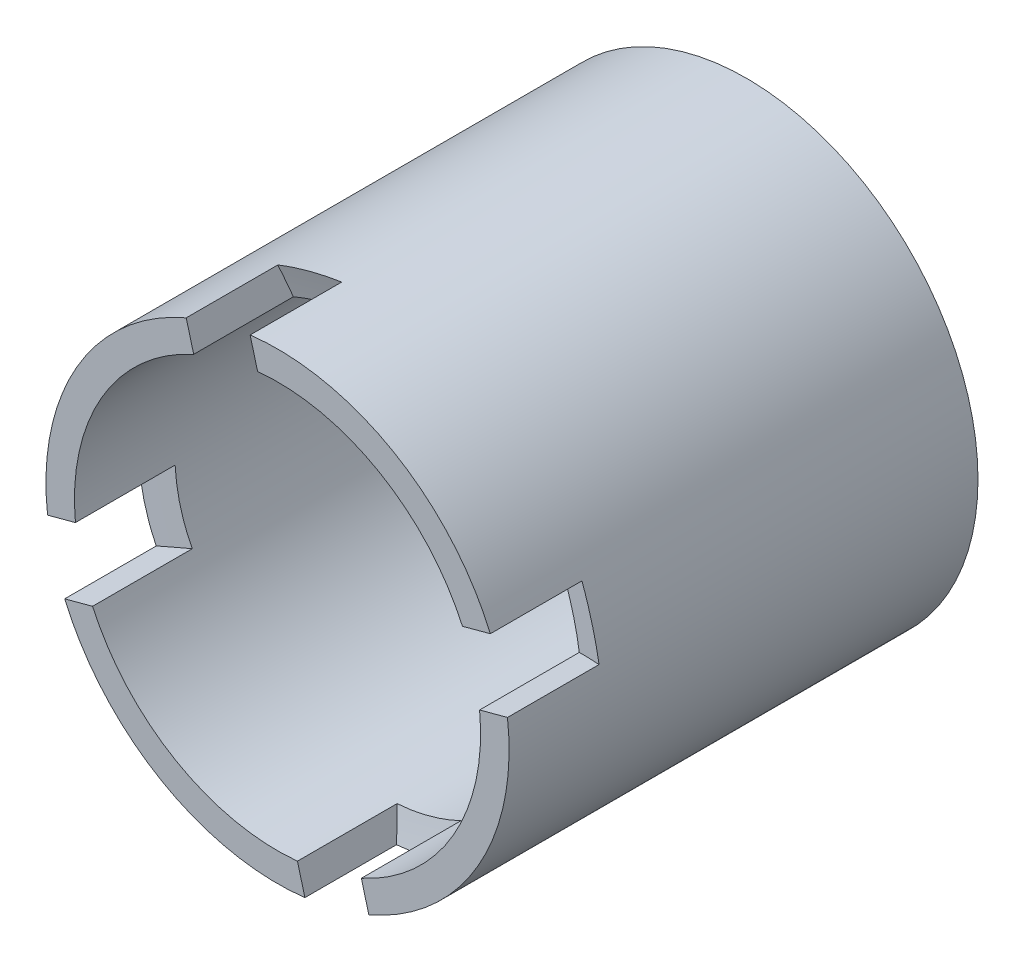
ISO-10303-21;
HEADER;
FILE_DESCRIPTION(('STEP AP214'),'2;1');
FILE_NAME('part.step','',(''),(''),'','','');
FILE_SCHEMA(('AUTOMOTIVE_DESIGN { 1 0 10303 214 1 1 1 1 }'));
ENDSEC;
DATA;
#1=APPLICATION_CONTEXT('core data for automotive mechanical design processes');
#2=APPLICATION_PROTOCOL_DEFINITION('international standard','automotive_design',2000,#1);
#3=PRODUCT_CONTEXT('',#1,'mechanical');
#4=PRODUCT('Part','Part','',(#3));
#5=PRODUCT_RELATED_PRODUCT_CATEGORY('part','',(#4));
#6=PRODUCT_DEFINITION_FORMATION('','',#4);
#7=PRODUCT_DEFINITION_CONTEXT('part definition',#1,'design');
#8=PRODUCT_DEFINITION('design','',#6,#7);
#9=PRODUCT_DEFINITION_SHAPE('','',#8);
#10=(LENGTH_UNIT() NAMED_UNIT(*) SI_UNIT(.MILLI.,.METRE.));
#11=(NAMED_UNIT(*) PLANE_ANGLE_UNIT() SI_UNIT($,.RADIAN.));
#12=(NAMED_UNIT(*) SI_UNIT($,.STERADIAN.) SOLID_ANGLE_UNIT());
#13=UNCERTAINTY_MEASURE_WITH_UNIT(LENGTH_MEASURE(1.E-05),#10,'distance_accuracy_value','');
#14=(GEOMETRIC_REPRESENTATION_CONTEXT(3) GLOBAL_UNCERTAINTY_ASSIGNED_CONTEXT((#13)) GLOBAL_UNIT_ASSIGNED_CONTEXT((#10,
#11,#12)) REPRESENTATION_CONTEXT('',''));
#15=CARTESIAN_POINT('',(0.,0.,0.));
#16=DIRECTION('',(0.,0.,1.));
#17=DIRECTION('',(1.,0.,0.));
#18=AXIS2_PLACEMENT_3D('',#15,#16,#17);
#19=CARTESIAN_POINT('',(0.,0.,90.));
#20=DIRECTION('',(0.,0.,1.));
#21=DIRECTION('',(1.,0.,0.));
#22=AXIS2_PLACEMENT_3D('',#19,#20,#21);
#23=PLANE('',#22);
#24=CARTESIAN_POINT('',(0.,0.,90.));
#25=DIRECTION('',(0.,0.,1.));
#26=DIRECTION('',(1.,0.,0.));
#27=AXIS2_PLACEMENT_3D('',#24,#25,#26);
#28=CIRCLE('',#27,44.45);
#29=CARTESIAN_POINT('',(-40.8502605222262,-17.5230909164521,90.));
#30=VERTEX_POINT('',#29);
#31=CARTESIAN_POINT('',(5.25607059710619,-44.1381492801662,90.));
#32=VERTEX_POINT('',#31);
#33=EDGE_CURVE('E298',#30,#32,#28,.T.);
#34=ORIENTED_EDGE('',*,*,#33,.T.);
#35=DIRECTION('',(-0.258888878578149,0.965907111760002,0.));
#36=VECTOR('',#35,1.);
#37=CARTESIAN_POINT('',(-6.13351015967567,-1.64394437897115,90.));
#38=LINE('',#37,#36);
#39=CARTESIAN_POINT('',(3.82220451233839,-38.7884353171904,90.));
#40=VERTEX_POINT('',#39);
#41=EDGE_CURVE('E315',#32,#40,#38,.T.);
#42=ORIENTED_EDGE('',*,*,#41,.T.);
#43=CARTESIAN_POINT('',(0.,0.,90.));
#44=DIRECTION('',(0.,0.,1.));
#45=DIRECTION('',(1.,0.,0.));
#46=AXIS2_PLACEMENT_3D('',#43,#44,#45);
#47=CIRCLE('',#46,38.9763);
#48=CARTESIAN_POINT('',(-35.5005465592505,-16.0892248316844,90.));
#49=VERTEX_POINT('',#48);
#50=EDGE_CURVE('E292',#49,#40,#47,.T.);
#51=ORIENTED_EDGE('',*,*,#50,.F.);
#52=DIRECTION('',(0.965907111760002,0.258888878578149,0.));
#53=VECTOR('',#52,1.);
#54=CARTESIAN_POINT('',(1.64394437896965,-6.13351015967005,90.));
#55=LINE('',#54,#53);
#56=EDGE_CURVE('E313',#30,#49,#55,.T.);
#57=ORIENTED_EDGE('',*,*,#56,.F.);
#58=EDGE_LOOP('',(#34,#42,#51,#57));
#59=FACE_BOUND('',#58,.T.);
#60=ADVANCED_FACE('F36',(#59),#23,.T.);
#61=CARTESIAN_POINT('',(-17.5230909164573,40.850260522224,90.));
#62=VERTEX_POINT('',#61);
#63=CARTESIAN_POINT('',(-44.138149280167,-5.25607059709964,90.));
#64=VERTEX_POINT('',#63);
#65=EDGE_CURVE('E358',#62,#64,#28,.T.);
#66=ORIENTED_EDGE('',*,*,#65,.T.);
#67=DIRECTION('',(0.965907111760002,0.258888878578149,0.));
#68=VECTOR('',#67,1.);
#69=CARTESIAN_POINT('',(-1.64394437897284,6.13351015968197,90.));
#70=LINE('',#69,#68);
#71=CARTESIAN_POINT('',(-38.788435317191,-3.82220451233181,90.));
#72=VERTEX_POINT('',#71);
#73=EDGE_CURVE('E214',#64,#72,#70,.T.);
#74=ORIENTED_EDGE('',*,*,#73,.T.);
#75=CARTESIAN_POINT('',(-16.0892248316895,35.5005465592481,90.));
#76=VERTEX_POINT('',#75);
#77=EDGE_CURVE('E303',#76,#72,#47,.T.);
#78=ORIENTED_EDGE('',*,*,#77,.F.);
#79=DIRECTION('',(-0.258888878578149,0.965907111760002,0.));
#80=VECTOR('',#79,1.);
#81=CARTESIAN_POINT('',(-6.13351015967546,-1.6439443789711,90.));
#82=LINE('',#81,#80);
#83=EDGE_CURVE('E155',#76,#62,#82,.T.);
#84=ORIENTED_EDGE('',*,*,#83,.T.);
#85=EDGE_LOOP('',(#66,#74,#78,#84));
#86=FACE_BOUND('',#85,.T.);
#87=ADVANCED_FACE('F363',(#86),#23,.T.);
#88=CARTESIAN_POINT('',(35.5005465592453,16.0892248316958,90.));
#89=VERTEX_POINT('',#88);
#90=CARTESIAN_POINT('',(-3.82220451233746,38.7884353171904,90.));
#91=VERTEX_POINT('',#90);
#92=EDGE_CURVE('E293',#89,#91,#47,.T.);
#93=ORIENTED_EDGE('',*,*,#92,.F.);
#94=CARTESIAN_POINT('',(40.8502605222213,17.5230909164636,90.));
#95=VERTEX_POINT('',#94);
#96=EDGE_CURVE('E208',#89,#95,#70,.T.);
#97=ORIENTED_EDGE('',*,*,#96,.T.);
#98=CARTESIAN_POINT('',(-5.25607059710526,44.1381492801663,90.));
#99=VERTEX_POINT('',#98);
#100=EDGE_CURVE('E161',#95,#99,#28,.T.);
#101=ORIENTED_EDGE('',*,*,#100,.T.);
#102=DIRECTION('',(-0.258888878578149,0.965907111760002,0.));
#103=VECTOR('',#102,1.);
#104=CARTESIAN_POINT('',(6.13351015967656,1.64394437897139,90.));
#105=LINE('',#104,#103);
#106=EDGE_CURVE('E349',#91,#99,#105,.T.);
#107=ORIENTED_EDGE('',*,*,#106,.F.);
#108=EDGE_LOOP('',(#93,#97,#101,#107));
#109=FACE_BOUND('',#108,.T.);
#110=ADVANCED_FACE('F357',(#109),#23,.T.);
#111=DIRECTION('',(-0.258888878578149,0.965907111760002,0.));
#112=VECTOR('',#111,1.);
#113=CARTESIAN_POINT('',(6.13351015967636,1.64394437897134,90.));
#114=LINE('',#113,#112);
#115=CARTESIAN_POINT('',(17.5230909164582,-40.8502605222236,90.));
#116=VERTEX_POINT('',#115);
#117=CARTESIAN_POINT('',(16.0892248316904,-35.5005465592477,90.));
#118=VERTEX_POINT('',#117);
#119=EDGE_CURVE('E320',#116,#118,#114,.T.);
#120=ORIENTED_EDGE('',*,*,#119,.F.);
#121=CARTESIAN_POINT('',(44.1381492801655,5.25607059711202,90.));
#122=VERTEX_POINT('',#121);
#123=EDGE_CURVE('E296',#116,#122,#28,.T.);
#124=ORIENTED_EDGE('',*,*,#123,.T.);
#125=CARTESIAN_POINT('',(38.7884353171898,3.82220451234426,90.));
#126=VERTEX_POINT('',#125);
#127=EDGE_CURVE('E339',#126,#122,#55,.T.);
#128=ORIENTED_EDGE('',*,*,#127,.F.);
#129=EDGE_CURVE('E289',#118,#126,#47,.T.);
#130=ORIENTED_EDGE('',*,*,#129,.F.);
#131=EDGE_LOOP('',(#120,#124,#128,#130));
#132=FACE_BOUND('',#131,.T.);
#133=ADVANCED_FACE('F337',(#132),#23,.T.);
#134=CARTESIAN_POINT('',(0.,0.,0.));
#135=DIRECTION('',(0.,0.,1.));
#136=DIRECTION('',(1.,0.,0.));
#137=AXIS2_PLACEMENT_3D('',#134,#135,#136);
#138=PLANE('',#137);
#139=CARTESIAN_POINT('',(0.,0.,0.));
#140=DIRECTION('',(0.,0.,1.));
#141=DIRECTION('',(1.,0.,0.));
#142=AXIS2_PLACEMENT_3D('',#139,#140,#141);
#143=CIRCLE('',#142,44.45);
#144=CARTESIAN_POINT('',(44.45,0.,0.));
#145=VERTEX_POINT('',#144);
#146=EDGE_CURVE('E299',#145,#145,#143,.T.);
#147=ORIENTED_EDGE('',*,*,#146,.F.);
#148=EDGE_LOOP('',(#147));
#149=FACE_BOUND('',#148,.T.);
#150=CARTESIAN_POINT('',(0.,0.,0.));
#151=DIRECTION('',(0.,0.,1.));
#152=DIRECTION('',(1.,0.,0.));
#153=AXIS2_PLACEMENT_3D('',#150,#151,#152);
#154=CIRCLE('',#153,38.9763);
#155=CARTESIAN_POINT('',(38.9763,0.,0.));
#156=VERTEX_POINT('',#155);
#157=EDGE_CURVE('E286',#156,#156,#154,.T.);
#158=ORIENTED_EDGE('',*,*,#157,.T.);
#159=EDGE_LOOP('',(#158));
#160=FACE_BOUND('',#159,.T.);
#161=ADVANCED_FACE('F389',(#149,#160),#138,.F.);
#162=CARTESIAN_POINT('',(0.,0.,90.));
#163=DIRECTION('',(0.,0.,-1.));
#164=DIRECTION('',(-1.,0.,0.));
#165=AXIS2_PLACEMENT_3D('',#162,#163,#164);
#166=CYLINDRICAL_SURFACE('',#165,44.45);
#167=ORIENTED_EDGE('',*,*,#123,.F.);
#168=DIRECTION('',(0.,0.,-1.));
#169=VECTOR('',#168,1.);
#170=CARTESIAN_POINT('',(17.5230909164582,-40.8502605222236,90.));
#171=LINE('',#170,#169);
#172=CARTESIAN_POINT('',(17.5230909164584,-40.8502605222235,72.4201087779347));
#173=VERTEX_POINT('',#172);
#174=EDGE_CURVE('E287',#116,#173,#171,.T.);
#175=ORIENTED_EDGE('',*,*,#174,.T.);
#176=CARTESIAN_POINT('',(5.2560705971064,-44.1381492801661,72.4201087779347));
#177=CARTESIAN_POINT('',(5.78450712012225,-44.0752231478757,72.4430344687902));
#178=CARTESIAN_POINT('',(6.3118879433372,-44.0027946493171,72.4631685328877));
#179=CARTESIAN_POINT('',(7.36389102003117,-43.8390124230854,72.4977564616334));
#180=CARTESIAN_POINT('',(7.8885132666841,-43.7476586486045,72.5122103122322));
#181=CARTESIAN_POINT('',(9.45125441727098,-43.4464880361932,72.5467729856208));
#182=CARTESIAN_POINT('',(10.4843389410903,-43.2088352397161,72.5583484025618));
#183=CARTESIAN_POINT('',(12.5308823645083,-42.6603069957478,72.5583484025618));
#184=CARTESIAN_POINT('',(13.5443412641069,-42.3494315482567,72.5467729856207));
#185=CARTESIAN_POINT('',(15.0482248215905,-41.8286649142946,72.5122103122322));
#186=CARTESIAN_POINT('',(15.5482114072583,-41.64539618279,72.4977564616333));
#187=CARTESIAN_POINT('',(16.5411083512673,-41.2610906408307,72.4631685328877));
#188=CARTESIAN_POINT('',(17.0340187271072,-41.0600538743235,72.4430344687901));
#189=CARTESIAN_POINT('',(17.5230909164584,-40.8502605222235,72.4201087779346));
#190=B_SPLINE_CURVE_WITH_KNOTS('',3,(#176,#177,#178,#179,#180,#181,#182,#183,#184,#185,#186,
#187,#188,#189),.UNSPECIFIED.,.F.,.F.,(4,2,2,2,2,2,4),(0.,1.59780698578492,3.19561792348022,
6.37286652782528,9.55011513217035,11.1479260698656,12.7457330556506),.UNSPECIFIED.);
#191=CARTESIAN_POINT('',(5.2560705971064,-44.1381492801661,72.4201087779347));
#192=VERTEX_POINT('',#191);
#193=EDGE_CURVE('E279',#192,#173,#190,.T.);
#194=ORIENTED_EDGE('',*,*,#193,.F.);
#195=DIRECTION('',(0.,0.,-1.));
#196=VECTOR('',#195,1.);
#197=CARTESIAN_POINT('',(5.25607059710619,-44.1381492801662,90.));
#198=LINE('',#197,#196);
#199=EDGE_CURVE('E317',#32,#192,#198,.T.);
#200=ORIENTED_EDGE('',*,*,#199,.F.);
#201=ORIENTED_EDGE('',*,*,#33,.F.);
#202=DIRECTION('',(0.,0.,-1.));
#203=VECTOR('',#202,1.);
#204=CARTESIAN_POINT('',(-40.8502605222262,-17.5230909164521,89.9999999999998));
#205=LINE('',#204,#203);
#206=CARTESIAN_POINT('',(-40.8502605222263,-17.5230909164517,72.420108777934));
#207=VERTEX_POINT('',#206);
#208=EDGE_CURVE('E318',#30,#207,#205,.T.);
#209=ORIENTED_EDGE('',*,*,#208,.T.);
#210=CARTESIAN_POINT('',(-44.1381492801662,-5.25607059710264,72.4201087779338));
#211=CARTESIAN_POINT('',(-44.0752231478761,-5.78450712011854,72.4430344687893));
#212=CARTESIAN_POINT('',(-44.0027946493176,-6.31188794333352,72.463168532887));
#213=CARTESIAN_POINT('',(-43.8390124230861,-7.36389102002754,72.4977564616326));
#214=CARTESIAN_POINT('',(-43.7476586486051,-7.88851326668048,72.5122103122314));
#215=CARTESIAN_POINT('',(-43.446488036194,-9.4512544172674,72.54677298562));
#216=CARTESIAN_POINT('',(-43.2088352397169,-10.4843389410868,72.5583484025611));
#217=CARTESIAN_POINT('',(-42.6603069957488,-12.5308823645048,72.5583484025611));
#218=CARTESIAN_POINT('',(-42.3494315482578,-13.5443412641034,72.54677298562));
#219=CARTESIAN_POINT('',(-41.8286649142958,-15.0482248215871,72.5122103122314));
#220=CARTESIAN_POINT('',(-41.6453961827912,-15.5482114072549,72.4977564616325));
#221=CARTESIAN_POINT('',(-41.2610906408321,-16.5411083512639,72.4631685328869));
#222=CARTESIAN_POINT('',(-41.0600538743249,-17.0340187271039,72.4430344687893));
#223=CARTESIAN_POINT('',(-40.8502605222249,-17.5230909164551,72.4201087779339));
#224=B_SPLINE_CURVE_WITH_KNOTS('',3,(#210,#211,#212,#213,#214,#215,#216,#217,#218,#219,#220,
#221,#222,#223),.UNSPECIFIED.,.F.,.F.,(4,2,2,2,2,2,4),(0.,1.59780698578495,3.19561792348028,
6.37286652782537,9.55011513217045,11.1479260698658,12.7457330556507),.UNSPECIFIED.);
#225=CARTESIAN_POINT('',(-44.1381492801661,-5.25607059710264,72.4201087779339));
#226=VERTEX_POINT('',#225);
#227=EDGE_CURVE('E225',#226,#207,#224,.T.);
#228=ORIENTED_EDGE('',*,*,#227,.F.);
#229=DIRECTION('',(0.,0.,-1.));
#230=VECTOR('',#229,1.);
#231=CARTESIAN_POINT('',(-44.138149280167,-5.25607059709964,90.0000000000002));
#232=LINE('',#231,#230);
#233=EDGE_CURVE('E216',#64,#226,#232,.T.);
#234=ORIENTED_EDGE('',*,*,#233,.F.);
#235=ORIENTED_EDGE('',*,*,#65,.F.);
#236=DIRECTION('',(0.,0.,-1.));
#237=VECTOR('',#236,1.);
#238=CARTESIAN_POINT('',(-17.5230909164573,40.850260522224,90.));
#239=LINE('',#238,#237);
#240=CARTESIAN_POINT('',(-17.5230909164573,40.8502605222239,72.4201087779329));
#241=VERTEX_POINT('',#240);
#242=EDGE_CURVE('E342',#241,#62,#239,.F.);
#243=ORIENTED_EDGE('',*,*,#242,.F.);
#244=CARTESIAN_POINT('',(-5.25607059710525,44.1381492801663,72.4201087779328));
#245=CARTESIAN_POINT('',(-5.78450712012109,44.0752231478759,72.4430344687882));
#246=CARTESIAN_POINT('',(-6.31188794333604,44.0027946493172,72.4631685328858));
#247=CARTESIAN_POINT('',(-7.36389102003002,43.8390124230856,72.4977564616314));
#248=CARTESIAN_POINT('',(-7.88851326668295,43.7476586486047,72.5122103122303));
#249=CARTESIAN_POINT('',(-9.45125441726984,43.4464880361935,72.5467729856189));
#250=CARTESIAN_POINT('',(-10.4843389410892,43.2088352397163,72.55834840256));
#251=CARTESIAN_POINT('',(-12.5308823645071,42.6603069957481,72.55834840256));
#252=CARTESIAN_POINT('',(-13.5443412641057,42.3494315482571,72.5467729856189));
#253=CARTESIAN_POINT('',(-15.0482248215894,41.828664914295,72.5122103122303));
#254=CARTESIAN_POINT('',(-15.5482114072572,41.6453961827904,72.4977564616315));
#255=CARTESIAN_POINT('',(-16.5411083512662,41.2610906408312,72.4631685328859));
#256=CARTESIAN_POINT('',(-17.0340187271061,41.0600538743239,72.4430344687883));
#257=CARTESIAN_POINT('',(-17.5230909164573,40.850260522224,72.4201087779328));
#258=B_SPLINE_CURVE_WITH_KNOTS('',3,(#244,#245,#246,#247,#248,#249,#250,#251,#252,#253,#254,
#255,#256,#257),.UNSPECIFIED.,.F.,.F.,(4,2,2,2,2,2,4),(0.,1.59780698578491,3.19561792348021,
6.37286652782527,9.55011513217034,11.1479260698656,12.7457330556506),.UNSPECIFIED.);
#259=CARTESIAN_POINT('',(-5.25607059710524,44.1381492801663,72.4201087779328));
#260=VERTEX_POINT('',#259);
#261=EDGE_CURVE('E168',#260,#241,#258,.T.);
#262=ORIENTED_EDGE('',*,*,#261,.F.);
#263=DIRECTION('',(0.,0.,-1.));
#264=VECTOR('',#263,1.);
#265=CARTESIAN_POINT('',(-5.25607059710526,44.1381492801663,90.));
#266=LINE('',#265,#264);
#267=EDGE_CURVE('E209',#260,#99,#266,.F.);
#268=ORIENTED_EDGE('',*,*,#267,.T.);
#269=ORIENTED_EDGE('',*,*,#100,.F.);
#270=DIRECTION('',(0.,0.,-1.));
#271=VECTOR('',#270,1.);
#272=CARTESIAN_POINT('',(40.8502605222213,17.5230909164636,90.0000000000002));
#273=LINE('',#272,#271);
#274=CARTESIAN_POINT('',(40.8502605222221,17.5230909164606,72.4201087779335));
#275=VERTEX_POINT('',#274);
#276=EDGE_CURVE('E213',#275,#95,#273,.F.);
#277=ORIENTED_EDGE('',*,*,#276,.F.);
#278=CARTESIAN_POINT('',(44.1381492801663,5.25607059710902,72.4201087779337));
#279=CARTESIAN_POINT('',(44.0752231478756,5.78450712012481,72.4430344687891));
#280=CARTESIAN_POINT('',(44.0027946493167,6.31188794333973,72.4631685328866));
#281=CARTESIAN_POINT('',(43.839012423085,7.36389102003365,72.4977564616322));
#282=CARTESIAN_POINT('',(43.747658648604,7.88851326668657,72.5122103122311));
#283=CARTESIAN_POINT('',(43.4464880361927,9.45125441727342,72.5467729856197));
#284=CARTESIAN_POINT('',(43.2088352397155,10.4843389410927,72.5583484025608));
#285=CARTESIAN_POINT('',(42.6603069957471,12.5308823645106,72.5583484025608));
#286=CARTESIAN_POINT('',(42.3494315482559,13.5443412641092,72.5467729856197));
#287=CARTESIAN_POINT('',(41.8286649142937,15.0482248215928,72.5122103122311));
#288=CARTESIAN_POINT('',(41.6453961827891,15.5482114072606,72.4977564616322));
#289=CARTESIAN_POINT('',(41.2610906408298,16.5411083512695,72.4631685328866));
#290=CARTESIAN_POINT('',(41.0600538743226,17.0340187271095,72.443034468789));
#291=CARTESIAN_POINT('',(40.8502605222226,17.5230909164606,72.4201087779336));
#292=B_SPLINE_CURVE_WITH_KNOTS('',3,(#278,#279,#280,#281,#282,#283,#284,#285,#286,#287,#288,
#289,#290,#291),.UNSPECIFIED.,.F.,.F.,(4,2,2,2,2,2,4),(0.,1.59780698578488,3.19561792348015,
6.37286652782518,9.55011513217023,11.1479260698655,12.7457330556504),.UNSPECIFIED.);
#293=CARTESIAN_POINT('',(44.1381492801654,5.25607059711244,72.4201087779337));
#294=VERTEX_POINT('',#293);
#295=EDGE_CURVE('E218',#294,#275,#292,.T.);
#296=ORIENTED_EDGE('',*,*,#295,.F.);
#297=DIRECTION('',(0.,0.,-1.));
#298=VECTOR('',#297,1.);
#299=CARTESIAN_POINT('',(44.1381492801655,5.25607059711202,89.9999999999998));
#300=LINE('',#299,#298);
#301=EDGE_CURVE('E505',#294,#122,#300,.F.);
#302=ORIENTED_EDGE('',*,*,#301,.T.);
#303=EDGE_LOOP('',(#167,#175,#194,#200,#201,#209,#228,#234,#235,#243,#262,#268,#269,#277,#296,#302));
#304=FACE_BOUND('',#303,.T.);
#305=ORIENTED_EDGE('',*,*,#146,.T.);
#306=EDGE_LOOP('',(#305));
#307=FACE_BOUND('',#306,.T.);
#308=ADVANCED_FACE('F38',(#304,#307),#166,.T.);
#309=CARTESIAN_POINT('',(0.,0.,90.));
#310=DIRECTION('',(0.,0.,-1.));
#311=DIRECTION('',(-1.,0.,0.));
#312=AXIS2_PLACEMENT_3D('',#309,#310,#311);
#313=CYLINDRICAL_SURFACE('',#312,38.9763);
#314=DIRECTION('',(0.,0.,-1.));
#315=VECTOR('',#314,1.);
#316=CARTESIAN_POINT('',(16.0892248316904,-35.5005465592477,90.));
#317=LINE('',#316,#315);
#318=CARTESIAN_POINT('',(16.0892248316906,-35.5005465592477,70.8635947793906));
#319=VERTEX_POINT('',#318);
#320=EDGE_CURVE('E11',#118,#319,#317,.T.);
#321=ORIENTED_EDGE('',*,*,#320,.F.);
#322=ORIENTED_EDGE('',*,*,#129,.T.);
#323=DIRECTION('',(0.,0.,-1.));
#324=VECTOR('',#323,1.);
#325=CARTESIAN_POINT('',(38.7884353171898,3.82220451234426,89.9999999999998));
#326=LINE('',#325,#324);
#327=CARTESIAN_POINT('',(38.7884353171897,3.82220451234471,70.8635947793897));
#328=VERTEX_POINT('',#327);
#329=EDGE_CURVE('E251',#328,#126,#326,.F.);
#330=ORIENTED_EDGE('',*,*,#329,.F.);
#331=CARTESIAN_POINT('',(38.7884353171906,3.82220451234126,70.8635947793898));
#332=CARTESIAN_POINT('',(38.7361536287446,4.35278488106166,70.8862498717163));
#333=CARTESIAN_POINT('',(38.6729749943483,4.88235078217362,70.9061653445404));
#334=CARTESIAN_POINT('',(38.5249160184421,5.93862283102108,70.9403961197162));
#335=CARTESIAN_POINT('',(38.4400356347079,6.4653289731904,70.9547114111718));
#336=CARTESIAN_POINT('',(38.1543820117049,8.0322207775633,70.9889077212545));
#337=CARTESIAN_POINT('',(37.9218255035547,9.06697525241977,71.0003739369808));
#338=CARTESIAN_POINT('',(37.3731452166264,11.1140859438371,71.0003739369808));
#339=CARTESIAN_POINT('',(37.0570214378483,12.126442160398,70.9889077212545));
#340=CARTESIAN_POINT('',(36.520741972221,13.6261595516729,70.9547114111718));
#341=CARTESIAN_POINT('',(36.3308253792511,14.1247131871591,70.9403961197163));
#342=CARTESIAN_POINT('',(35.9307692193472,15.1134432668298,70.9061653445404));
#343=CARTESIAN_POINT('',(35.7206296917612,15.6036197273118,70.8862498717163));
#344=CARTESIAN_POINT('',(35.5005465592467,16.0892248316928,70.8635947793897));
#345=B_SPLINE_CURVE_WITH_KNOTS('',3,(#331,#332,#333,#334,#335,#336,#337,#338,#339,#340,#341,
#342,#343,#344),.UNSPECIFIED.,.F.,.F.,(4,2,2,2,2,2,4),(0.,1.6006585476694,3.20132020970339,
6.37919853167279,9.55707685364222,11.1577385156762,12.7583970633457),.UNSPECIFIED.);
#346=CARTESIAN_POINT('',(35.5005465592461,16.0892248316927,70.8635947793896));
#347=VERTEX_POINT('',#346);
#348=EDGE_CURVE('E244',#328,#347,#345,.T.);
#349=ORIENTED_EDGE('',*,*,#348,.T.);
#350=DIRECTION('',(0.,0.,-1.));
#351=VECTOR('',#350,1.);
#352=CARTESIAN_POINT('',(35.5005465592453,16.0892248316957,90.0000000000002));
#353=LINE('',#352,#351);
#354=EDGE_CURVE('E178',#347,#89,#353,.F.);
#355=ORIENTED_EDGE('',*,*,#354,.T.);
#356=ORIENTED_EDGE('',*,*,#92,.T.);
#357=DIRECTION('',(0.,0.,-1.));
#358=VECTOR('',#357,1.);
#359=CARTESIAN_POINT('',(-3.82220451233746,38.7884353171904,90.));
#360=LINE('',#359,#358);
#361=CARTESIAN_POINT('',(-3.82220451233745,38.7884353171904,70.863594779389));
#362=VERTEX_POINT('',#361);
#363=EDGE_CURVE('E176',#362,#91,#360,.F.);
#364=ORIENTED_EDGE('',*,*,#363,.F.);
#365=CARTESIAN_POINT('',(-3.82220451233745,38.7884353171905,70.863594779389));
#366=CARTESIAN_POINT('',(-4.35278488105791,38.7361536287448,70.8862498717156));
#367=CARTESIAN_POINT('',(-4.88235078216991,38.6729749943487,70.9061653445397));
#368=CARTESIAN_POINT('',(-5.93862283101741,38.5249160184427,70.9403961197155));
#369=CARTESIAN_POINT('',(-6.46532897318675,38.4400356347085,70.9547114111711));
#370=CARTESIAN_POINT('',(-8.0322207775597,38.1543820117056,70.9889077212538));
#371=CARTESIAN_POINT('',(-9.06697525241621,37.9218255035556,71.0003739369801));
#372=CARTESIAN_POINT('',(-11.1140859438336,37.3731452166275,71.0003739369801));
#373=CARTESIAN_POINT('',(-12.1264421603946,37.0570214378494,70.9889077212538));
#374=CARTESIAN_POINT('',(-13.6261595516695,36.5207419722222,70.9547114111711));
#375=CARTESIAN_POINT('',(-14.1247131871557,36.3308253792524,70.9403961197156));
#376=CARTESIAN_POINT('',(-15.1134432668265,35.9307692193486,70.9061653445398));
#377=CARTESIAN_POINT('',(-15.6036197273085,35.7206296917626,70.8862498717157));
#378=CARTESIAN_POINT('',(-16.0892248316895,35.5005465592481,70.863594779389));
#379=B_SPLINE_CURVE_WITH_KNOTS('',3,(#365,#366,#367,#368,#369,#370,#371,#372,#373,#374,#375,
#376,#377,#378),.UNSPECIFIED.,.F.,.F.,(4,2,2,2,2,2,4),(0.,1.60065854766945,3.20132020970346,
6.37919853167291,9.55707685364236,11.1577385156764,12.7583970633458),.UNSPECIFIED.);
#380=CARTESIAN_POINT('',(-16.0892248316895,35.5005465592481,70.863594779389));
#381=VERTEX_POINT('',#380);
#382=EDGE_CURVE('E160',#362,#381,#379,.T.);
#383=ORIENTED_EDGE('',*,*,#382,.T.);
#384=DIRECTION('',(0.,0.,-1.));
#385=VECTOR('',#384,1.);
#386=CARTESIAN_POINT('',(-16.0892248316895,35.5005465592481,90.));
#387=LINE('',#386,#385);
#388=EDGE_CURVE('E149',#381,#76,#387,.F.);
#389=ORIENTED_EDGE('',*,*,#388,.T.);
#390=ORIENTED_EDGE('',*,*,#77,.T.);
#391=DIRECTION('',(0.,0.,-1.));
#392=VECTOR('',#391,1.);
#393=CARTESIAN_POINT('',(-38.788435317191,-3.82220451233181,90.0000000000002));
#394=LINE('',#393,#392);
#395=CARTESIAN_POINT('',(-38.7884353171902,-3.82220451233481,70.8635947793899));
#396=VERTEX_POINT('',#395);
#397=EDGE_CURVE('E253',#72,#396,#394,.T.);
#398=ORIENTED_EDGE('',*,*,#397,.T.);
#399=CARTESIAN_POINT('',(-38.7884353171902,-3.82220451233481,70.8635947793899));
#400=CARTESIAN_POINT('',(-38.7361536287449,-4.35278488105532,70.8862498717165));
#401=CARTESIAN_POINT('',(-38.6729749943489,-4.88235078216736,70.9061653445407));
#402=CARTESIAN_POINT('',(-38.5249160184431,-5.93862283101491,70.9403961197166));
#403=CARTESIAN_POINT('',(-38.440035634709,-6.46532897318427,70.9547114111721));
#404=CARTESIAN_POINT('',(-38.1543820117061,-8.03222077755725,70.9889077212548));
#405=CARTESIAN_POINT('',(-37.9218255035561,-9.06697525241379,71.0003739369811));
#406=CARTESIAN_POINT('',(-37.3731452166282,-11.1140859438313,71.0003739369811));
#407=CARTESIAN_POINT('',(-37.0570214378502,-12.1264421603922,70.9889077212548));
#408=CARTESIAN_POINT('',(-36.5207419722231,-13.6261595516672,70.9547114111721));
#409=CARTESIAN_POINT('',(-36.3308253792533,-14.1247131871534,70.9403961197165));
#410=CARTESIAN_POINT('',(-35.9307692193496,-15.1134432668243,70.9061653445406));
#411=CARTESIAN_POINT('',(-35.7206296917636,-15.6036197273063,70.8862498717165));
#412=CARTESIAN_POINT('',(-35.5005465592491,-16.0892248316873,70.8635947793899));
#413=B_SPLINE_CURVE_WITH_KNOTS('',3,(#399,#400,#401,#402,#403,#404,#405,#406,#407,#408,#409,
#410,#411,#412),.UNSPECIFIED.,.F.,.F.,(4,2,2,2,2,2,4),(0.,1.6006585476695,3.20132020970354,
6.37919853167304,9.5570768536425,11.1577385156765,12.758397063346),.UNSPECIFIED.);
#414=CARTESIAN_POINT('',(-35.5005465592506,-16.0892248316839,70.8635947793901));
#415=VERTEX_POINT('',#414);
#416=EDGE_CURVE('E256',#396,#415,#413,.T.);
#417=ORIENTED_EDGE('',*,*,#416,.T.);
#418=DIRECTION('',(0.,0.,-1.));
#419=VECTOR('',#418,1.);
#420=CARTESIAN_POINT('',(-35.5005465592505,-16.0892248316844,89.9999999999998));
#421=LINE('',#420,#419);
#422=EDGE_CURVE('E263',#49,#415,#421,.T.);
#423=ORIENTED_EDGE('',*,*,#422,.F.);
#424=ORIENTED_EDGE('',*,*,#50,.T.);
#425=DIRECTION('',(0.,0.,-1.));
#426=VECTOR('',#425,1.);
#427=CARTESIAN_POINT('',(3.82220451233839,-38.7884353171904,90.));
#428=LINE('',#427,#426);
#429=CARTESIAN_POINT('',(3.82220451233861,-38.7884353171903,70.8635947793906));
#430=VERTEX_POINT('',#429);
#431=EDGE_CURVE('E265',#40,#430,#428,.T.);
#432=ORIENTED_EDGE('',*,*,#431,.T.);
#433=CARTESIAN_POINT('',(3.82220451233861,-38.7884353171903,70.8635947793906));
#434=CARTESIAN_POINT('',(4.35278488105907,-38.7361536287447,70.8862498717173));
#435=CARTESIAN_POINT('',(4.88235078217107,-38.6729749943485,70.9061653445414));
#436=CARTESIAN_POINT('',(5.93862283101857,-38.5249160184425,70.9403961197172));
#437=CARTESIAN_POINT('',(6.46532897318791,-38.4400356347083,70.9547114111728));
#438=CARTESIAN_POINT('',(8.03222077756086,-38.1543820117053,70.9889077212555));
#439=CARTESIAN_POINT('',(9.06697525241736,-37.9218255035553,71.0003739369817));
#440=CARTESIAN_POINT('',(11.1140859438348,-37.3731452166271,71.0003739369817));
#441=CARTESIAN_POINT('',(12.1264421603957,-37.057021437849,70.9889077212554));
#442=CARTESIAN_POINT('',(13.6261595516706,-36.5207419722218,70.9547114111727));
#443=CARTESIAN_POINT('',(14.1247131871568,-36.330825379252,70.9403961197172));
#444=CARTESIAN_POINT('',(15.1134432668276,-35.9307692193481,70.9061653445413));
#445=CARTESIAN_POINT('',(15.6036197273096,-35.7206296917622,70.8862498717172));
#446=CARTESIAN_POINT('',(16.0892248316906,-35.5005465592477,70.8635947793905));
#447=B_SPLINE_CURVE_WITH_KNOTS('',3,(#433,#434,#435,#436,#437,#438,#439,#440,#441,#442,#443,
#444,#445,#446),.UNSPECIFIED.,.F.,.F.,(4,2,2,2,2,2,4),(0.,1.60065854766945,3.20132020970347,
6.37919853167292,9.55707685364237,11.1577385156764,12.7583970633458),.UNSPECIFIED.);
#448=EDGE_CURVE('E45',#430,#319,#447,.T.);
#449=ORIENTED_EDGE('',*,*,#448,.T.);
#450=EDGE_LOOP('',(#321,#322,#330,#349,#355,#356,#364,#383,#389,#390,#398,#417,#423,#424,#432,#449));
#451=FACE_BOUND('',#450,.T.);
#452=ORIENTED_EDGE('',*,*,#157,.F.);
#453=EDGE_LOOP('',(#452));
#454=FACE_BOUND('',#453,.T.);
#455=ADVANCED_FACE('F173',(#451,#454),#313,.F.);
#456=CARTESIAN_POINT('',(-6.13351015967624,-1.64394437896814,218.332));
#457=DIRECTION('',(0.965907111760002,0.258888878578149,0.));
#458=DIRECTION('',(0.,0.,1.));
#459=AXIS2_PLACEMENT_3D('',#456,#457,#458);
#460=PLANE('',#459);
#461=ORIENTED_EDGE('',*,*,#242,.T.);
#462=ORIENTED_EDGE('',*,*,#83,.F.);
#463=ORIENTED_EDGE('',*,*,#388,.F.);
#464=CARTESIAN_POINT('',(-6.13351015967624,-1.64394437896814,218.332));
#465=DIRECTION('',(0.965907111760002,0.258888878578149,0.));
#466=DIRECTION('',(0.,0.,1.));
#467=AXIS2_PLACEMENT_3D('',#464,#465,#466);
#468=CIRCLE('',#467,152.4);
#469=EDGE_CURVE('E152',#381,#241,#468,.T.);
#470=ORIENTED_EDGE('',*,*,#469,.T.);
#471=EDGE_LOOP('',(#461,#462,#463,#470));
#472=FACE_BOUND('',#471,.T.);
#473=ADVANCED_FACE('F151',(#472),#460,.T.);
#474=CARTESIAN_POINT('',(6.13351015967578,1.64394437897435,218.332));
#475=DIRECTION('',(0.965907111760002,0.258888878578149,0.));
#476=DIRECTION('',(0.,0.,1.));
#477=AXIS2_PLACEMENT_3D('',#474,#475,#476);
#478=PLANE('',#477);
#479=CARTESIAN_POINT('',(6.13351015967578,1.64394437897435,218.332));
#480=DIRECTION('',(0.965907111760002,0.258888878578149,0.));
#481=DIRECTION('',(0.,0.,1.));
#482=AXIS2_PLACEMENT_3D('',#479,#480,#481);
#483=CIRCLE('',#482,152.4);
#484=EDGE_CURVE('E169',#362,#260,#483,.T.);
#485=ORIENTED_EDGE('',*,*,#484,.F.);
#486=ORIENTED_EDGE('',*,*,#363,.T.);
#487=ORIENTED_EDGE('',*,*,#106,.T.);
#488=ORIENTED_EDGE('',*,*,#267,.F.);
#489=EDGE_LOOP('',(#485,#486,#487,#488));
#490=FACE_BOUND('',#489,.T.);
#491=ADVANCED_FACE('F196',(#490),#478,.F.);
#492=CARTESIAN_POINT('',(6.13351015967578,1.64394437897435,218.332));
#493=DIRECTION('',(-0.965907111760002,-0.258888878578149,0.));
#494=DIRECTION('',(0.,0.,-1.));
#495=AXIS2_PLACEMENT_3D('',#492,#493,#494);
#496=CYLINDRICAL_SURFACE('',#495,152.4);
#497=ORIENTED_EDGE('',*,*,#261,.T.);
#498=ORIENTED_EDGE('',*,*,#469,.F.);
#499=ORIENTED_EDGE('',*,*,#382,.F.);
#500=ORIENTED_EDGE('',*,*,#484,.T.);
#501=EDGE_LOOP('',(#497,#498,#499,#500));
#502=FACE_BOUND('',#501,.T.);
#503=ADVANCED_FACE('F164',(#502),#496,.F.);
#504=CARTESIAN_POINT('',(-1.64394437897148,6.13351015967912,218.332));
#505=DIRECTION('',(0.258888878578149,-0.965907111760002,0.));
#506=DIRECTION('',(0.965907111760002,0.258888878578149,0.));
#507=AXIS2_PLACEMENT_3D('',#504,#505,#506);
#508=PLANE('',#507);
#509=ORIENTED_EDGE('',*,*,#276,.T.);
#510=ORIENTED_EDGE('',*,*,#96,.F.);
#511=ORIENTED_EDGE('',*,*,#354,.F.);
#512=CARTESIAN_POINT('',(-1.64394437897148,6.13351015967912,218.332));
#513=DIRECTION('',(0.258888878578149,-0.965907111760002,0.));
#514=DIRECTION('',(0.965907111760002,0.258888878578149,0.));
#515=AXIS2_PLACEMENT_3D('',#512,#513,#514);
#516=CIRCLE('',#515,152.4);
#517=EDGE_CURVE('E371',#347,#275,#516,.T.);
#518=ORIENTED_EDGE('',*,*,#517,.T.);
#519=EDGE_LOOP('',(#509,#510,#511,#518));
#520=FACE_BOUND('',#519,.T.);
#521=ADVANCED_FACE('F195',(#520),#508,.T.);
#522=CARTESIAN_POINT('',(1.64394437897101,-6.1335101596729,218.332));
#523=DIRECTION('',(-0.258888878578149,0.965907111760002,0.));
#524=DIRECTION('',(-0.965907111760002,-0.258888878578149,0.));
#525=AXIS2_PLACEMENT_3D('',#522,#523,#524);
#526=CYLINDRICAL_SURFACE('',#525,152.4);
#527=ORIENTED_EDGE('',*,*,#295,.T.);
#528=ORIENTED_EDGE('',*,*,#517,.F.);
#529=ORIENTED_EDGE('',*,*,#348,.F.);
#530=CARTESIAN_POINT('',(1.64394437897101,-6.1335101596729,218.332));
#531=DIRECTION('',(0.258888878578149,-0.965907111760002,0.));
#532=DIRECTION('',(0.965907111760002,0.258888878578149,0.));
#533=AXIS2_PLACEMENT_3D('',#530,#531,#532);
#534=CIRCLE('',#533,152.4);
#535=EDGE_CURVE('E370',#328,#294,#534,.T.);
#536=ORIENTED_EDGE('',*,*,#535,.T.);
#537=EDGE_LOOP('',(#527,#528,#529,#536));
#538=FACE_BOUND('',#537,.T.);
#539=ADVANCED_FACE('F232',(#538),#526,.F.);
#540=CARTESIAN_POINT('',(1.64394437897101,-6.1335101596729,218.332));
#541=DIRECTION('',(0.258888878578149,-0.965907111760002,0.));
#542=DIRECTION('',(0.965907111760002,0.258888878578149,0.));
#543=AXIS2_PLACEMENT_3D('',#540,#541,#542);
#544=PLANE('',#543);
#545=ORIENTED_EDGE('',*,*,#535,.F.);
#546=ORIENTED_EDGE('',*,*,#329,.T.);
#547=ORIENTED_EDGE('',*,*,#127,.T.);
#548=ORIENTED_EDGE('',*,*,#301,.F.);
#549=EDGE_LOOP('',(#545,#546,#547,#548));
#550=FACE_BOUND('',#549,.T.);
#551=ADVANCED_FACE('F236',(#550),#544,.F.);
#552=ORIENTED_EDGE('',*,*,#233,.T.);
#553=CARTESIAN_POINT('',(-1.64394437897148,6.13351015967912,218.332));
#554=DIRECTION('',(0.258888878578149,-0.965907111760002,0.));
#555=DIRECTION('',(0.965907111760002,0.258888878578149,0.));
#556=AXIS2_PLACEMENT_3D('',#553,#554,#555);
#557=CIRCLE('',#556,152.4);
#558=EDGE_CURVE('E60',#226,#396,#557,.T.);
#559=ORIENTED_EDGE('',*,*,#558,.T.);
#560=ORIENTED_EDGE('',*,*,#397,.F.);
#561=ORIENTED_EDGE('',*,*,#73,.F.);
#562=EDGE_LOOP('',(#552,#559,#560,#561));
#563=FACE_BOUND('',#562,.T.);
#564=ADVANCED_FACE('F366',(#563),#508,.T.);
#565=CARTESIAN_POINT('',(1.64394437897101,-6.1335101596729,218.332));
#566=DIRECTION('',(-0.258888878578149,0.965907111760002,0.));
#567=DIRECTION('',(-0.965907111760002,-0.258888878578149,0.));
#568=AXIS2_PLACEMENT_3D('',#565,#566,#567);
#569=CYLINDRICAL_SURFACE('',#568,152.4);
#570=ORIENTED_EDGE('',*,*,#227,.T.);
#571=CARTESIAN_POINT('',(1.64394437897101,-6.1335101596729,218.332));
#572=DIRECTION('',(0.258888878578149,-0.965907111760002,0.));
#573=DIRECTION('',(0.965907111760002,0.258888878578149,0.));
#574=AXIS2_PLACEMENT_3D('',#571,#572,#573);
#575=CIRCLE('',#574,152.4);
#576=EDGE_CURVE('E344',#207,#415,#575,.T.);
#577=ORIENTED_EDGE('',*,*,#576,.T.);
#578=ORIENTED_EDGE('',*,*,#416,.F.);
#579=ORIENTED_EDGE('',*,*,#558,.F.);
#580=EDGE_LOOP('',(#570,#577,#578,#579));
#581=FACE_BOUND('',#580,.T.);
#582=ADVANCED_FACE('F238',(#581),#569,.F.);
#583=ORIENTED_EDGE('',*,*,#56,.T.);
#584=ORIENTED_EDGE('',*,*,#422,.T.);
#585=ORIENTED_EDGE('',*,*,#576,.F.);
#586=ORIENTED_EDGE('',*,*,#208,.F.);
#587=EDGE_LOOP('',(#583,#584,#585,#586));
#588=FACE_BOUND('',#587,.T.);
#589=ADVANCED_FACE('F198',(#588),#544,.F.);
#590=CARTESIAN_POINT('',(6.13351015967578,1.64394437897435,218.332));
#591=DIRECTION('',(-0.965907111760002,-0.258888878578149,0.));
#592=DIRECTION('',(0.258888878578149,-0.965907111760002,0.));
#593=AXIS2_PLACEMENT_3D('',#590,#591,#592);
#594=CYLINDRICAL_SURFACE('',#593,152.4);
#595=ORIENTED_EDGE('',*,*,#193,.T.);
#596=CARTESIAN_POINT('',(6.13351015967578,1.64394437897435,218.332));
#597=DIRECTION('',(0.965907111760002,0.258888878578149,0.));
#598=DIRECTION('',(-0.258888878578149,0.965907111760002,0.));
#599=AXIS2_PLACEMENT_3D('',#596,#597,#598);
#600=CIRCLE('',#599,152.4);
#601=EDGE_CURVE('E334',#173,#319,#600,.T.);
#602=ORIENTED_EDGE('',*,*,#601,.T.);
#603=ORIENTED_EDGE('',*,*,#448,.F.);
#604=CARTESIAN_POINT('',(-6.13351015967624,-1.64394437896814,218.332));
#605=DIRECTION('',(0.965907111760002,0.258888878578149,0.));
#606=DIRECTION('',(-0.258888878578149,0.965907111760002,0.));
#607=AXIS2_PLACEMENT_3D('',#604,#605,#606);
#608=CIRCLE('',#607,152.4);
#609=EDGE_CURVE('E52',#192,#430,#608,.T.);
#610=ORIENTED_EDGE('',*,*,#609,.F.);
#611=EDGE_LOOP('',(#595,#602,#603,#610));
#612=FACE_BOUND('',#611,.T.);
#613=ADVANCED_FACE('F272',(#612),#594,.F.);
#614=CARTESIAN_POINT('',(6.13351015967578,1.64394437897435,218.332));
#615=DIRECTION('',(0.965907111760002,0.258888878578149,0.));
#616=DIRECTION('',(-0.258888878578149,0.965907111760002,0.));
#617=AXIS2_PLACEMENT_3D('',#614,#615,#616);
#618=PLANE('',#617);
#619=ORIENTED_EDGE('',*,*,#119,.T.);
#620=ORIENTED_EDGE('',*,*,#320,.T.);
#621=ORIENTED_EDGE('',*,*,#601,.F.);
#622=ORIENTED_EDGE('',*,*,#174,.F.);
#623=EDGE_LOOP('',(#619,#620,#621,#622));
#624=FACE_BOUND('',#623,.T.);
#625=ADVANCED_FACE('F240',(#624),#618,.F.);
#626=CARTESIAN_POINT('',(-6.13351015967624,-1.64394437896814,218.332));
#627=DIRECTION('',(0.965907111760002,0.258888878578149,0.));
#628=DIRECTION('',(-0.258888878578149,0.965907111760002,0.));
#629=AXIS2_PLACEMENT_3D('',#626,#627,#628);
#630=PLANE('',#629);
#631=ORIENTED_EDGE('',*,*,#199,.T.);
#632=ORIENTED_EDGE('',*,*,#609,.T.);
#633=ORIENTED_EDGE('',*,*,#431,.F.);
#634=ORIENTED_EDGE('',*,*,#41,.F.);
#635=EDGE_LOOP('',(#631,#632,#633,#634));
#636=FACE_BOUND('',#635,.T.);
#637=ADVANCED_FACE('F276',(#636),#630,.T.);
#638=CLOSED_SHELL('',(#60,#87,#110,#133,#161,#308,#455,#473,#491,#503,#521,#539,#551,#564,#582,
#589,#613,#625,#637));
#639=MANIFOLD_SOLID_BREP('B2',#638);
#640=ADVANCED_BREP_SHAPE_REPRESENTATION('',(#18,#639),#14);
#641=SHAPE_DEFINITION_REPRESENTATION(#9,#640);
ENDSEC;
END-ISO-10303-21;
